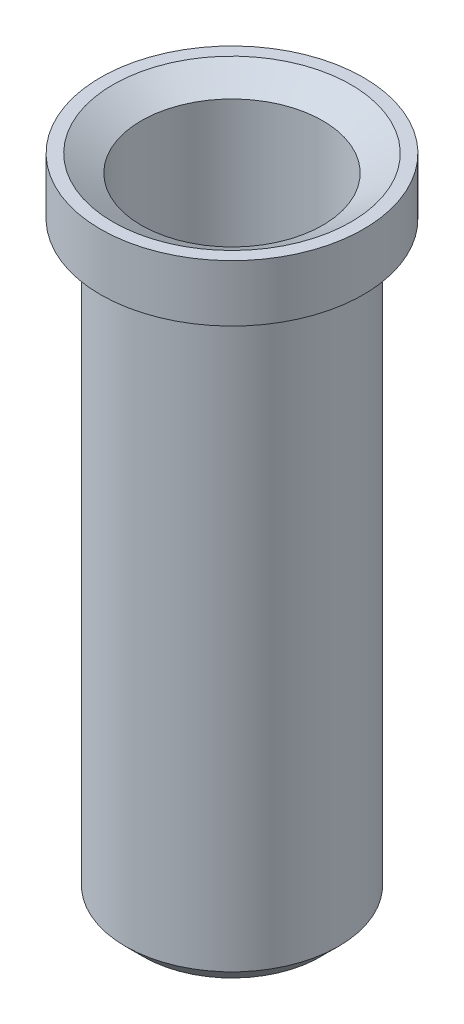
ISO-10303-21;
HEADER;
FILE_DESCRIPTION(('STEP AP214'),'2;1');
FILE_NAME('part.step','',(''),(''),'','','');
FILE_SCHEMA(('AUTOMOTIVE_DESIGN { 1 0 10303 214 1 1 1 1 }'));
ENDSEC;
DATA;
#1=APPLICATION_CONTEXT('core data for automotive mechanical design processes');
#2=APPLICATION_PROTOCOL_DEFINITION('international standard','automotive_design',2000,#1);
#3=PRODUCT_CONTEXT('',#1,'mechanical');
#4=PRODUCT('Part','Part','',(#3));
#5=PRODUCT_RELATED_PRODUCT_CATEGORY('part','',(#4));
#6=PRODUCT_DEFINITION_FORMATION('','',#4);
#7=PRODUCT_DEFINITION_CONTEXT('part definition',#1,'design');
#8=PRODUCT_DEFINITION('design','',#6,#7);
#9=PRODUCT_DEFINITION_SHAPE('','',#8);
#10=(LENGTH_UNIT() NAMED_UNIT(*) SI_UNIT(.MILLI.,.METRE.));
#11=(NAMED_UNIT(*) PLANE_ANGLE_UNIT() SI_UNIT($,.RADIAN.));
#12=(NAMED_UNIT(*) SI_UNIT($,.STERADIAN.) SOLID_ANGLE_UNIT());
#13=UNCERTAINTY_MEASURE_WITH_UNIT(LENGTH_MEASURE(1.E-05),#10,'distance_accuracy_value','');
#14=(GEOMETRIC_REPRESENTATION_CONTEXT(3) GLOBAL_UNCERTAINTY_ASSIGNED_CONTEXT((#13)) GLOBAL_UNIT_ASSIGNED_CONTEXT((#10,
#11,#12)) REPRESENTATION_CONTEXT('',''));
#15=CARTESIAN_POINT('',(0.,0.,0.));
#16=DIRECTION('',(0.,0.,1.));
#17=DIRECTION('',(1.,0.,0.));
#18=AXIS2_PLACEMENT_3D('',#15,#16,#17);
#19=CARTESIAN_POINT('',(0.,-5.25,0.));
#20=DIRECTION('',(0.,-1.,0.));
#21=DIRECTION('',(0.,0.,-1.));
#22=AXIS2_PLACEMENT_3D('',#19,#20,#21);
#23=PLANE('',#22);
#24=CARTESIAN_POINT('',(0.,-5.25,0.));
#25=DIRECTION('',(0.,-1.,0.));
#26=DIRECTION('',(0.,0.,-1.));
#27=AXIS2_PLACEMENT_3D('',#24,#25,#26);
#28=CIRCLE('',#27,0.780000000000004);
#29=CARTESIAN_POINT('',(0.,-5.25,-0.780000000000004));
#30=VERTEX_POINT('',#29);
#31=EDGE_CURVE('E11',#30,#30,#28,.T.);
#32=ORIENTED_EDGE('',*,*,#31,.T.);
#33=EDGE_LOOP('',(#32));
#34=FACE_BOUND('',#33,.T.);
#35=ADVANCED_FACE('F35',(#34),#23,.T.);
#36=CARTESIAN_POINT('',(0.,8.23878905517164,0.));
#37=DIRECTION('',(0.,1.,0.));
#38=DIRECTION('',(0.,0.,1.));
#39=AXIS2_PLACEMENT_3D('',#36,#37,#38);
#40=CYLINDRICAL_SURFACE('',#39,0.940000000000001);
#41=CARTESIAN_POINT('',(0.,-5.09,0.));
#42=DIRECTION('',(0.,-1.,0.));
#43=DIRECTION('',(0.,0.,-1.));
#44=AXIS2_PLACEMENT_3D('',#41,#42,#43);
#45=CIRCLE('',#44,0.940000000000001);
#46=CARTESIAN_POINT('',(0.,-5.09,-0.940000000000001));
#47=VERTEX_POINT('',#46);
#48=EDGE_CURVE('E42',#47,#47,#45,.F.);
#49=ORIENTED_EDGE('',*,*,#48,.T.);
#50=EDGE_LOOP('',(#49));
#51=FACE_BOUND('',#50,.T.);
#52=CARTESIAN_POINT('',(0.,0.,0.));
#53=DIRECTION('',(0.,1.,0.));
#54=DIRECTION('',(0.,0.,1.));
#55=AXIS2_PLACEMENT_3D('',#52,#53,#54);
#56=CIRCLE('',#55,0.940000000000001);
#57=CARTESIAN_POINT('',(0.,0.,0.940000000000001));
#58=VERTEX_POINT('',#57);
#59=EDGE_CURVE('E102',#58,#58,#56,.T.);
#60=ORIENTED_EDGE('',*,*,#59,.F.);
#61=EDGE_LOOP('',(#60));
#62=FACE_BOUND('',#61,.T.);
#63=ADVANCED_FACE('F60',(#51,#62),#40,.T.);
#64=CARTESIAN_POINT('',(-0.940000000000001,0.,0.));
#65=DIRECTION('',(0.,-1.,0.));
#66=DIRECTION('',(0.,0.,-1.));
#67=AXIS2_PLACEMENT_3D('',#64,#65,#66);
#68=PLANE('',#67);
#69=ORIENTED_EDGE('',*,*,#59,.T.);
#70=EDGE_LOOP('',(#69));
#71=FACE_BOUND('',#70,.T.);
#72=CARTESIAN_POINT('',(0.,0.,0.));
#73=DIRECTION('',(0.,1.,0.));
#74=DIRECTION('',(0.,0.,1.));
#75=AXIS2_PLACEMENT_3D('',#72,#73,#74);
#76=CIRCLE('',#75,1.16);
#77=CARTESIAN_POINT('',(0.,0.,1.16));
#78=VERTEX_POINT('',#77);
#79=EDGE_CURVE('E99',#78,#78,#76,.T.);
#80=ORIENTED_EDGE('',*,*,#79,.F.);
#81=EDGE_LOOP('',(#80));
#82=FACE_BOUND('',#81,.T.);
#83=ADVANCED_FACE('F65',(#71,#82),#68,.T.);
#84=CARTESIAN_POINT('',(0.,8.23878905517164,0.));
#85=DIRECTION('',(0.,1.,0.));
#86=DIRECTION('',(0.,0.,1.));
#87=AXIS2_PLACEMENT_3D('',#84,#85,#86);
#88=CYLINDRICAL_SURFACE('',#87,1.16);
#89=ORIENTED_EDGE('',*,*,#79,.T.);
#90=EDGE_LOOP('',(#89));
#91=FACE_BOUND('',#90,.T.);
#92=CARTESIAN_POINT('',(0.,0.499999999999999,0.));
#93=DIRECTION('',(0.,1.,0.));
#94=DIRECTION('',(0.,0.,1.));
#95=AXIS2_PLACEMENT_3D('',#92,#93,#94);
#96=CIRCLE('',#95,1.16);
#97=CARTESIAN_POINT('',(0.,0.499999999999999,1.16));
#98=VERTEX_POINT('',#97);
#99=EDGE_CURVE('E93',#98,#98,#96,.T.);
#100=ORIENTED_EDGE('',*,*,#99,.F.);
#101=EDGE_LOOP('',(#100));
#102=FACE_BOUND('',#101,.T.);
#103=ADVANCED_FACE('F71',(#91,#102),#88,.T.);
#104=CARTESIAN_POINT('',(-1.16,0.499999999999999,0.));
#105=DIRECTION('',(0.,1.,0.));
#106=DIRECTION('',(0.,0.,1.));
#107=AXIS2_PLACEMENT_3D('',#104,#105,#106);
#108=PLANE('',#107);
#109=ORIENTED_EDGE('',*,*,#99,.T.);
#110=EDGE_LOOP('',(#109));
#111=FACE_BOUND('',#110,.T.);
#112=CARTESIAN_POINT('',(0.,0.5,0.));
#113=DIRECTION('',(0.,1.,0.));
#114=DIRECTION('',(0.,0.,1.));
#115=AXIS2_PLACEMENT_3D('',#112,#113,#114);
#116=CIRCLE('',#115,1.05);
#117=CARTESIAN_POINT('',(0.,0.5,1.05));
#118=VERTEX_POINT('',#117);
#119=EDGE_CURVE('E87',#118,#118,#116,.T.);
#120=ORIENTED_EDGE('',*,*,#119,.F.);
#121=EDGE_LOOP('',(#120));
#122=FACE_BOUND('',#121,.T.);
#123=ADVANCED_FACE('F75',(#111,#122),#108,.T.);
#124=CARTESIAN_POINT('',(0.,0.34968967028951,0.));
#125=DIRECTION('',(0.,1.,0.));
#126=DIRECTION('',(0.,0.,1.));
#127=AXIS2_PLACEMENT_3D('',#124,#125,#126);
#128=CONICAL_SURFACE('',#127,0.799999999999999,1.02946459191165);
#129=ORIENTED_EDGE('',*,*,#119,.T.);
#130=EDGE_LOOP('',(#129));
#131=FACE_BOUND('',#130,.T.);
#132=CARTESIAN_POINT('',(0.,0.34968967028951,0.));
#133=DIRECTION('',(0.,1.,0.));
#134=DIRECTION('',(0.,0.,1.));
#135=AXIS2_PLACEMENT_3D('',#132,#133,#134);
#136=CIRCLE('',#135,0.799999999999999);
#137=CARTESIAN_POINT('',(0.,0.34968967028951,0.799999999999999));
#138=VERTEX_POINT('',#137);
#139=EDGE_CURVE('E90',#138,#138,#136,.T.);
#140=ORIENTED_EDGE('',*,*,#139,.F.);
#141=EDGE_LOOP('',(#140));
#142=FACE_BOUND('',#141,.T.);
#143=ADVANCED_FACE('F55',(#131,#142),#128,.F.);
#144=CARTESIAN_POINT('',(0.,8.23878905517164,0.));
#145=DIRECTION('',(0.,1.,0.));
#146=DIRECTION('',(0.,0.,1.));
#147=AXIS2_PLACEMENT_3D('',#144,#145,#146);
#148=CYLINDRICAL_SURFACE('',#147,0.799999999999999);
#149=ORIENTED_EDGE('',*,*,#139,.T.);
#150=EDGE_LOOP('',(#149));
#151=FACE_BOUND('',#150,.T.);
#152=CARTESIAN_POINT('',(0.,-4.,0.));
#153=DIRECTION('',(0.,1.,0.));
#154=DIRECTION('',(0.,0.,1.));
#155=AXIS2_PLACEMENT_3D('',#152,#153,#154);
#156=CIRCLE('',#155,0.799999999999998);
#157=CARTESIAN_POINT('',(0.,-4.,0.799999999999998));
#158=VERTEX_POINT('',#157);
#159=EDGE_CURVE('E91',#158,#158,#156,.T.);
#160=ORIENTED_EDGE('',*,*,#159,.F.);
#161=EDGE_LOOP('',(#160));
#162=FACE_BOUND('',#161,.T.);
#163=ADVANCED_FACE('F47',(#151,#162),#148,.F.);
#164=CARTESIAN_POINT('',(0.,-4.54564993317566,0.));
#165=DIRECTION('',(0.,1.,0.));
#166=DIRECTION('',(0.,0.,1.));
#167=AXIS2_PLACEMENT_3D('',#164,#165,#166);
#168=CONICAL_SURFACE('',#167,0.,0.972210725087973);
#169=ORIENTED_EDGE('',*,*,#159,.T.);
#170=EDGE_LOOP('',(#169));
#171=FACE_BOUND('',#170,.T.);
#172=CARTESIAN_POINT('',(0.,-4.54564993317566,0.));
#173=VERTEX_POINT('',#172);
#174=VERTEX_LOOP('',#173);
#175=FACE_BOUND('',#174,.T.);
#176=ADVANCED_FACE('F45',(#171,#175),#168,.F.);
#177=CARTESIAN_POINT('',(0.,-5.09,0.));
#178=DIRECTION('',(0.,1.,0.));
#179=DIRECTION('',(0.,0.,1.));
#180=AXIS2_PLACEMENT_3D('',#177,#178,#179);
#181=CONICAL_SURFACE('',#180,0.940000000000001,0.78539816339745);
#182=ORIENTED_EDGE('',*,*,#31,.F.);
#183=EDGE_LOOP('',(#182));
#184=FACE_BOUND('',#183,.T.);
#185=ORIENTED_EDGE('',*,*,#48,.F.);
#186=EDGE_LOOP('',(#185));
#187=FACE_BOUND('',#186,.T.);
#188=ADVANCED_FACE('F37',(#184,#187),#181,.T.);
#189=CLOSED_SHELL('',(#35,#63,#83,#103,#123,#143,#163,#176,#188));
#190=MANIFOLD_SOLID_BREP('B2',#189);
#191=ADVANCED_BREP_SHAPE_REPRESENTATION('',(#18,#190),#14);
#192=SHAPE_DEFINITION_REPRESENTATION(#9,#191);
ENDSEC;
END-ISO-10303-21;
